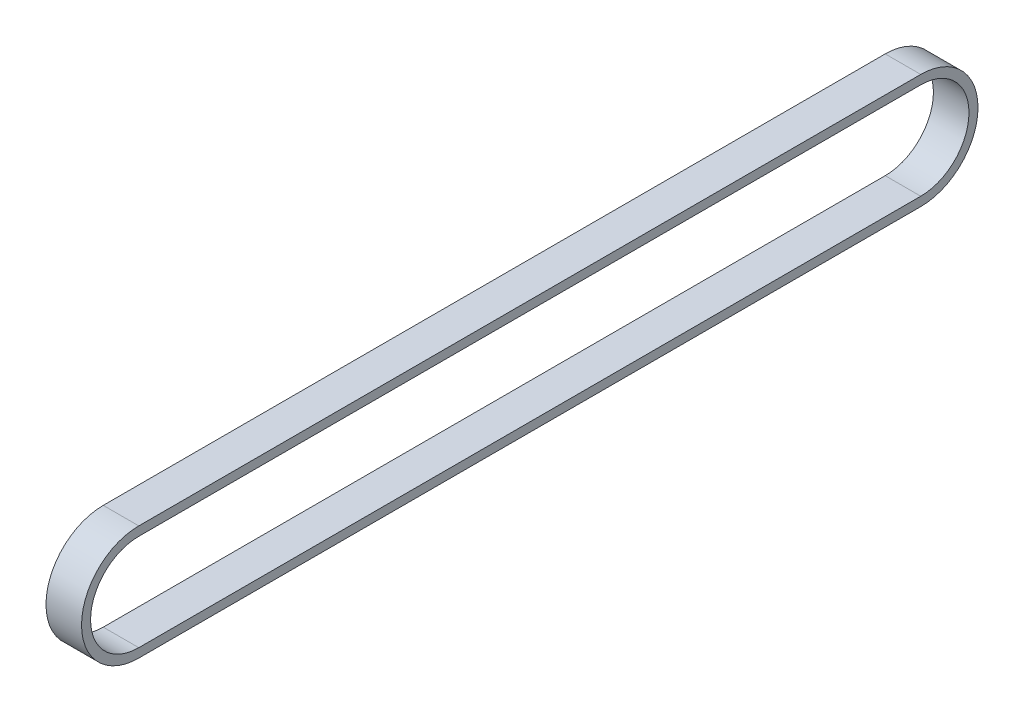
ISO-10303-21;
HEADER;
FILE_DESCRIPTION(('STEP AP214'),'2;1');
FILE_NAME('part.step','',(''),(''),'','','');
FILE_SCHEMA(('AUTOMOTIVE_DESIGN { 1 0 10303 214 1 1 1 1 }'));
ENDSEC;
DATA;
#1=APPLICATION_CONTEXT('core data for automotive mechanical design processes');
#2=APPLICATION_PROTOCOL_DEFINITION('international standard','automotive_design',2000,#1);
#3=PRODUCT_CONTEXT('',#1,'mechanical');
#4=PRODUCT('Part','Part','',(#3));
#5=PRODUCT_RELATED_PRODUCT_CATEGORY('part','',(#4));
#6=PRODUCT_DEFINITION_FORMATION('','',#4);
#7=PRODUCT_DEFINITION_CONTEXT('part definition',#1,'design');
#8=PRODUCT_DEFINITION('design','',#6,#7);
#9=PRODUCT_DEFINITION_SHAPE('','',#8);
#10=(LENGTH_UNIT() NAMED_UNIT(*) SI_UNIT(.MILLI.,.METRE.));
#11=(NAMED_UNIT(*) PLANE_ANGLE_UNIT() SI_UNIT($,.RADIAN.));
#12=(NAMED_UNIT(*) SI_UNIT($,.STERADIAN.) SOLID_ANGLE_UNIT());
#13=UNCERTAINTY_MEASURE_WITH_UNIT(LENGTH_MEASURE(1.E-05),#10,'distance_accuracy_value','');
#14=(GEOMETRIC_REPRESENTATION_CONTEXT(3) GLOBAL_UNCERTAINTY_ASSIGNED_CONTEXT((#13)) GLOBAL_UNIT_ASSIGNED_CONTEXT((#10,
#11,#12)) REPRESENTATION_CONTEXT('',''));
#15=CARTESIAN_POINT('',(0.,0.,0.));
#16=DIRECTION('',(0.,0.,1.));
#17=DIRECTION('',(1.,0.,0.));
#18=AXIS2_PLACEMENT_3D('',#15,#16,#17);
#19=CARTESIAN_POINT('',(15.,0.,-329.999993796));
#20=DIRECTION('',(1.,0.,0.));
#21=DIRECTION('',(0.,0.,-1.));
#22=AXIS2_PLACEMENT_3D('',#19,#20,#21);
#23=PLANE('',#22);
#24=CARTESIAN_POINT('',(15.,0.,-329.999993796));
#25=DIRECTION('',(1.,0.,0.));
#26=DIRECTION('',(0.,0.,-1.));
#27=AXIS2_PLACEMENT_3D('',#24,#25,#26);
#28=CIRCLE('',#27,24.1612916139695);
#29=CARTESIAN_POINT('',(15.,-24.1612916139695,-329.999993796));
#30=VERTEX_POINT('',#29);
#31=CARTESIAN_POINT('',(15.,24.1612916139695,-329.999993796));
#32=VERTEX_POINT('',#31);
#33=EDGE_CURVE('E136',#30,#32,#28,.T.);
#34=ORIENTED_EDGE('',*,*,#33,.T.);
#35=DIRECTION('',(0.,0.,1.));
#36=VECTOR('',#35,1.);
#37=CARTESIAN_POINT('',(15.,24.1612916139695,-329.999993796));
#38=LINE('',#37,#36);
#39=CARTESIAN_POINT('',(15.,24.1612916139695,0.));
#40=VERTEX_POINT('',#39);
#41=EDGE_CURVE('E139',#32,#40,#38,.T.);
#42=ORIENTED_EDGE('',*,*,#41,.T.);
#43=CARTESIAN_POINT('',(15.,0.,0.));
#44=DIRECTION('',(1.,0.,0.));
#45=DIRECTION('',(0.,0.,-1.));
#46=AXIS2_PLACEMENT_3D('',#43,#44,#45);
#47=CIRCLE('',#46,24.1612916139695);
#48=CARTESIAN_POINT('',(15.,-24.1612916139695,0.));
#49=VERTEX_POINT('',#48);
#50=EDGE_CURVE('E142',#40,#49,#47,.T.);
#51=ORIENTED_EDGE('',*,*,#50,.T.);
#52=DIRECTION('',(0.,0.,-1.));
#53=VECTOR('',#52,1.);
#54=CARTESIAN_POINT('',(15.,-24.1612916139695,0.));
#55=LINE('',#54,#53);
#56=EDGE_CURVE('E144',#49,#30,#55,.T.);
#57=ORIENTED_EDGE('',*,*,#56,.T.);
#58=EDGE_LOOP('',(#34,#42,#51,#57));
#59=FACE_BOUND('',#58,.T.);
#60=DIRECTION('',(0.,0.,1.));
#61=VECTOR('',#60,1.);
#62=CARTESIAN_POINT('',(15.,20.3512916139695,-329.999993796));
#63=LINE('',#62,#61);
#64=CARTESIAN_POINT('',(15.,20.3512916139695,-329.999993796));
#65=VERTEX_POINT('',#64);
#66=CARTESIAN_POINT('',(15.,20.3512916139695,0.));
#67=VERTEX_POINT('',#66);
#68=EDGE_CURVE('E108',#65,#67,#63,.T.);
#69=ORIENTED_EDGE('',*,*,#68,.F.);
#70=CARTESIAN_POINT('',(15.,0.,-329.999993796));
#71=DIRECTION('',(1.,0.,0.));
#72=DIRECTION('',(0.,0.,-1.));
#73=AXIS2_PLACEMENT_3D('',#70,#71,#72);
#74=CIRCLE('',#73,20.3512916139695);
#75=CARTESIAN_POINT('',(15.,-20.3512916139695,-329.999993796));
#76=VERTEX_POINT('',#75);
#77=EDGE_CURVE('E100',#76,#65,#74,.T.);
#78=ORIENTED_EDGE('',*,*,#77,.F.);
#79=DIRECTION('',(0.,0.,-1.));
#80=VECTOR('',#79,1.);
#81=CARTESIAN_POINT('',(15.,-20.3512916139695,0.));
#82=LINE('',#81,#80);
#83=CARTESIAN_POINT('',(15.,-20.3512916139695,0.));
#84=VERTEX_POINT('',#83);
#85=EDGE_CURVE('E122',#84,#76,#82,.T.);
#86=ORIENTED_EDGE('',*,*,#85,.F.);
#87=CARTESIAN_POINT('',(15.,0.,0.));
#88=DIRECTION('',(1.,0.,0.));
#89=DIRECTION('',(0.,0.,-1.));
#90=AXIS2_PLACEMENT_3D('',#87,#88,#89);
#91=CIRCLE('',#90,20.3512916139695);
#92=EDGE_CURVE('E120',#67,#84,#91,.T.);
#93=ORIENTED_EDGE('',*,*,#92,.F.);
#94=EDGE_LOOP('',(#69,#78,#86,#93));
#95=FACE_BOUND('',#94,.T.);
#96=ADVANCED_FACE('F35',(#59,#95),#23,.T.);
#97=CARTESIAN_POINT('',(0.,0.,-329.999993796));
#98=DIRECTION('',(1.,0.,0.));
#99=DIRECTION('',(0.,0.,-1.));
#100=AXIS2_PLACEMENT_3D('',#97,#98,#99);
#101=PLANE('',#100);
#102=CARTESIAN_POINT('',(0.,0.,-329.999993796));
#103=DIRECTION('',(1.,0.,0.));
#104=DIRECTION('',(0.,0.,-1.));
#105=AXIS2_PLACEMENT_3D('',#102,#103,#104);
#106=CIRCLE('',#105,24.1612916139695);
#107=CARTESIAN_POINT('',(0.,-24.1612916139695,-329.999993796));
#108=VERTEX_POINT('',#107);
#109=CARTESIAN_POINT('',(0.,24.1612916139695,-329.999993796));
#110=VERTEX_POINT('',#109);
#111=EDGE_CURVE('E116',#108,#110,#106,.T.);
#112=ORIENTED_EDGE('',*,*,#111,.F.);
#113=DIRECTION('',(0.,0.,-1.));
#114=VECTOR('',#113,1.);
#115=CARTESIAN_POINT('',(0.,-24.1612916139695,0.));
#116=LINE('',#115,#114);
#117=CARTESIAN_POINT('',(0.,-24.1612916139695,0.));
#118=VERTEX_POINT('',#117);
#119=EDGE_CURVE('E140',#118,#108,#116,.T.);
#120=ORIENTED_EDGE('',*,*,#119,.F.);
#121=CARTESIAN_POINT('',(0.,0.,0.));
#122=DIRECTION('',(1.,0.,0.));
#123=DIRECTION('',(0.,0.,-1.));
#124=AXIS2_PLACEMENT_3D('',#121,#122,#123);
#125=CIRCLE('',#124,24.1612916139695);
#126=CARTESIAN_POINT('',(0.,24.1612916139695,0.));
#127=VERTEX_POINT('',#126);
#128=EDGE_CURVE('E151',#127,#118,#125,.T.);
#129=ORIENTED_EDGE('',*,*,#128,.F.);
#130=DIRECTION('',(0.,0.,1.));
#131=VECTOR('',#130,1.);
#132=CARTESIAN_POINT('',(0.,24.1612916139695,-329.999993796));
#133=LINE('',#132,#131);
#134=EDGE_CURVE('E149',#110,#127,#133,.T.);
#135=ORIENTED_EDGE('',*,*,#134,.F.);
#136=EDGE_LOOP('',(#112,#120,#129,#135));
#137=FACE_BOUND('',#136,.T.);
#138=CARTESIAN_POINT('',(0.,0.,-329.999993796));
#139=DIRECTION('',(1.,0.,0.));
#140=DIRECTION('',(0.,0.,-1.));
#141=AXIS2_PLACEMENT_3D('',#138,#139,#140);
#142=CIRCLE('',#141,20.3512916139695);
#143=CARTESIAN_POINT('',(0.,-20.3512916139695,-329.999993796));
#144=VERTEX_POINT('',#143);
#145=CARTESIAN_POINT('',(0.,20.3512916139695,-329.999993796));
#146=VERTEX_POINT('',#145);
#147=EDGE_CURVE('E58',#144,#146,#142,.T.);
#148=ORIENTED_EDGE('',*,*,#147,.T.);
#149=DIRECTION('',(0.,0.,1.));
#150=VECTOR('',#149,1.);
#151=CARTESIAN_POINT('',(0.,20.3512916139695,-329.999993796));
#152=LINE('',#151,#150);
#153=CARTESIAN_POINT('',(0.,20.3512916139695,0.));
#154=VERTEX_POINT('',#153);
#155=EDGE_CURVE('E115',#146,#154,#152,.T.);
#156=ORIENTED_EDGE('',*,*,#155,.T.);
#157=CARTESIAN_POINT('',(0.,0.,0.));
#158=DIRECTION('',(1.,0.,0.));
#159=DIRECTION('',(0.,0.,-1.));
#160=AXIS2_PLACEMENT_3D('',#157,#158,#159);
#161=CIRCLE('',#160,20.3512916139695);
#162=CARTESIAN_POINT('',(0.,-20.3512916139695,0.));
#163=VERTEX_POINT('',#162);
#164=EDGE_CURVE('E128',#154,#163,#161,.T.);
#165=ORIENTED_EDGE('',*,*,#164,.T.);
#166=DIRECTION('',(0.,0.,-1.));
#167=VECTOR('',#166,1.);
#168=CARTESIAN_POINT('',(0.,-20.3512916139695,0.));
#169=LINE('',#168,#167);
#170=EDGE_CURVE('E109',#163,#144,#169,.T.);
#171=ORIENTED_EDGE('',*,*,#170,.T.);
#172=EDGE_LOOP('',(#148,#156,#165,#171));
#173=FACE_BOUND('',#172,.T.);
#174=ADVANCED_FACE('F169',(#137,#173),#101,.F.);
#175=CARTESIAN_POINT('',(15.,0.,-329.999993796));
#176=DIRECTION('',(-1.,0.,0.));
#177=DIRECTION('',(0.,0.,1.));
#178=AXIS2_PLACEMENT_3D('',#175,#176,#177);
#179=CYLINDRICAL_SURFACE('',#178,24.1612916139695);
#180=ORIENTED_EDGE('',*,*,#111,.T.);
#181=DIRECTION('',(-1.,0.,0.));
#182=VECTOR('',#181,1.);
#183=CARTESIAN_POINT('',(15.,24.1612916139695,-329.999993796));
#184=LINE('',#183,#182);
#185=EDGE_CURVE('E11',#32,#110,#184,.T.);
#186=ORIENTED_EDGE('',*,*,#185,.F.);
#187=ORIENTED_EDGE('',*,*,#33,.F.);
#188=DIRECTION('',(-1.,0.,0.));
#189=VECTOR('',#188,1.);
#190=CARTESIAN_POINT('',(15.,-24.1612916139695,-329.999993796));
#191=LINE('',#190,#189);
#192=EDGE_CURVE('E146',#30,#108,#191,.T.);
#193=ORIENTED_EDGE('',*,*,#192,.T.);
#194=EDGE_LOOP('',(#180,#186,#187,#193));
#195=FACE_BOUND('',#194,.T.);
#196=ADVANCED_FACE('F37',(#195),#179,.T.);
#197=CARTESIAN_POINT('',(15.,24.1612916139695,-329.999993796));
#198=DIRECTION('',(0.,-1.,0.));
#199=DIRECTION('',(0.,0.,-1.));
#200=AXIS2_PLACEMENT_3D('',#197,#198,#199);
#201=PLANE('',#200);
#202=ORIENTED_EDGE('',*,*,#134,.T.);
#203=DIRECTION('',(-1.,0.,0.));
#204=VECTOR('',#203,1.);
#205=CARTESIAN_POINT('',(15.,24.1612916139695,0.));
#206=LINE('',#205,#204);
#207=EDGE_CURVE('E43',#40,#127,#206,.T.);
#208=ORIENTED_EDGE('',*,*,#207,.F.);
#209=ORIENTED_EDGE('',*,*,#41,.F.);
#210=ORIENTED_EDGE('',*,*,#185,.T.);
#211=EDGE_LOOP('',(#202,#208,#209,#210));
#212=FACE_BOUND('',#211,.T.);
#213=ADVANCED_FACE('F179',(#212),#201,.F.);
#214=CARTESIAN_POINT('',(15.,0.,0.));
#215=DIRECTION('',(-1.,0.,0.));
#216=DIRECTION('',(0.,0.,1.));
#217=AXIS2_PLACEMENT_3D('',#214,#215,#216);
#218=CYLINDRICAL_SURFACE('',#217,24.1612916139695);
#219=ORIENTED_EDGE('',*,*,#128,.T.);
#220=DIRECTION('',(-1.,0.,0.));
#221=VECTOR('',#220,1.);
#222=CARTESIAN_POINT('',(15.,-24.1612916139695,0.));
#223=LINE('',#222,#221);
#224=EDGE_CURVE('E156',#49,#118,#223,.T.);
#225=ORIENTED_EDGE('',*,*,#224,.F.);
#226=ORIENTED_EDGE('',*,*,#50,.F.);
#227=ORIENTED_EDGE('',*,*,#207,.T.);
#228=EDGE_LOOP('',(#219,#225,#226,#227));
#229=FACE_BOUND('',#228,.T.);
#230=ADVANCED_FACE('F163',(#229),#218,.T.);
#231=CARTESIAN_POINT('',(15.,-24.1612916139695,0.));
#232=DIRECTION('',(0.,1.,0.));
#233=DIRECTION('',(0.,0.,1.));
#234=AXIS2_PLACEMENT_3D('',#231,#232,#233);
#235=PLANE('',#234);
#236=ORIENTED_EDGE('',*,*,#119,.T.);
#237=ORIENTED_EDGE('',*,*,#192,.F.);
#238=ORIENTED_EDGE('',*,*,#56,.F.);
#239=ORIENTED_EDGE('',*,*,#224,.T.);
#240=EDGE_LOOP('',(#236,#237,#238,#239));
#241=FACE_BOUND('',#240,.T.);
#242=ADVANCED_FACE('F173',(#241),#235,.F.);
#243=CARTESIAN_POINT('',(15.,0.,-329.999993796));
#244=DIRECTION('',(-1.,0.,0.));
#245=DIRECTION('',(0.,0.,1.));
#246=AXIS2_PLACEMENT_3D('',#243,#244,#245);
#247=CYLINDRICAL_SURFACE('',#246,20.3512916139695);
#248=ORIENTED_EDGE('',*,*,#147,.F.);
#249=DIRECTION('',(-1.,0.,0.));
#250=VECTOR('',#249,1.);
#251=CARTESIAN_POINT('',(15.,-20.3512916139695,-329.999993796));
#252=LINE('',#251,#250);
#253=EDGE_CURVE('E104',#76,#144,#252,.T.);
#254=ORIENTED_EDGE('',*,*,#253,.F.);
#255=ORIENTED_EDGE('',*,*,#77,.T.);
#256=DIRECTION('',(-1.,0.,0.));
#257=VECTOR('',#256,1.);
#258=CARTESIAN_POINT('',(15.,20.3512916139695,-329.999993796));
#259=LINE('',#258,#257);
#260=EDGE_CURVE('E103',#65,#146,#259,.T.);
#261=ORIENTED_EDGE('',*,*,#260,.T.);
#262=EDGE_LOOP('',(#248,#254,#255,#261));
#263=FACE_BOUND('',#262,.T.);
#264=ADVANCED_FACE('F102',(#263),#247,.F.);
#265=CARTESIAN_POINT('',(15.,20.3512916139695,-329.999993796));
#266=DIRECTION('',(0.,-1.,0.));
#267=DIRECTION('',(0.,0.,-1.));
#268=AXIS2_PLACEMENT_3D('',#265,#266,#267);
#269=PLANE('',#268);
#270=ORIENTED_EDGE('',*,*,#155,.F.);
#271=ORIENTED_EDGE('',*,*,#260,.F.);
#272=ORIENTED_EDGE('',*,*,#68,.T.);
#273=DIRECTION('',(-1.,0.,0.));
#274=VECTOR('',#273,1.);
#275=CARTESIAN_POINT('',(15.,20.3512916139695,0.));
#276=LINE('',#275,#274);
#277=EDGE_CURVE('E117',#67,#154,#276,.T.);
#278=ORIENTED_EDGE('',*,*,#277,.T.);
#279=EDGE_LOOP('',(#270,#271,#272,#278));
#280=FACE_BOUND('',#279,.T.);
#281=ADVANCED_FACE('F112',(#280),#269,.T.);
#282=CARTESIAN_POINT('',(15.,0.,0.));
#283=DIRECTION('',(-1.,0.,0.));
#284=DIRECTION('',(0.,0.,1.));
#285=AXIS2_PLACEMENT_3D('',#282,#283,#284);
#286=CYLINDRICAL_SURFACE('',#285,20.3512916139695);
#287=ORIENTED_EDGE('',*,*,#164,.F.);
#288=ORIENTED_EDGE('',*,*,#277,.F.);
#289=ORIENTED_EDGE('',*,*,#92,.T.);
#290=DIRECTION('',(-1.,0.,0.));
#291=VECTOR('',#290,1.);
#292=CARTESIAN_POINT('',(15.,-20.3512916139695,0.));
#293=LINE('',#292,#291);
#294=EDGE_CURVE('E50',#84,#163,#293,.T.);
#295=ORIENTED_EDGE('',*,*,#294,.T.);
#296=EDGE_LOOP('',(#287,#288,#289,#295));
#297=FACE_BOUND('',#296,.T.);
#298=ADVANCED_FACE('F202',(#297),#286,.F.);
#299=CARTESIAN_POINT('',(15.,-20.3512916139695,0.));
#300=DIRECTION('',(0.,1.,0.));
#301=DIRECTION('',(0.,0.,1.));
#302=AXIS2_PLACEMENT_3D('',#299,#300,#301);
#303=PLANE('',#302);
#304=ORIENTED_EDGE('',*,*,#170,.F.);
#305=ORIENTED_EDGE('',*,*,#294,.F.);
#306=ORIENTED_EDGE('',*,*,#85,.T.);
#307=ORIENTED_EDGE('',*,*,#253,.T.);
#308=EDGE_LOOP('',(#304,#305,#306,#307));
#309=FACE_BOUND('',#308,.T.);
#310=ADVANCED_FACE('F206',(#309),#303,.T.);
#311=CLOSED_SHELL('',(#96,#174,#196,#213,#230,#242,#264,#281,#298,#310));
#312=MANIFOLD_SOLID_BREP('B2',#311);
#313=ADVANCED_BREP_SHAPE_REPRESENTATION('',(#18,#312),#14);
#314=SHAPE_DEFINITION_REPRESENTATION(#9,#313);
ENDSEC;
END-ISO-10303-21;
